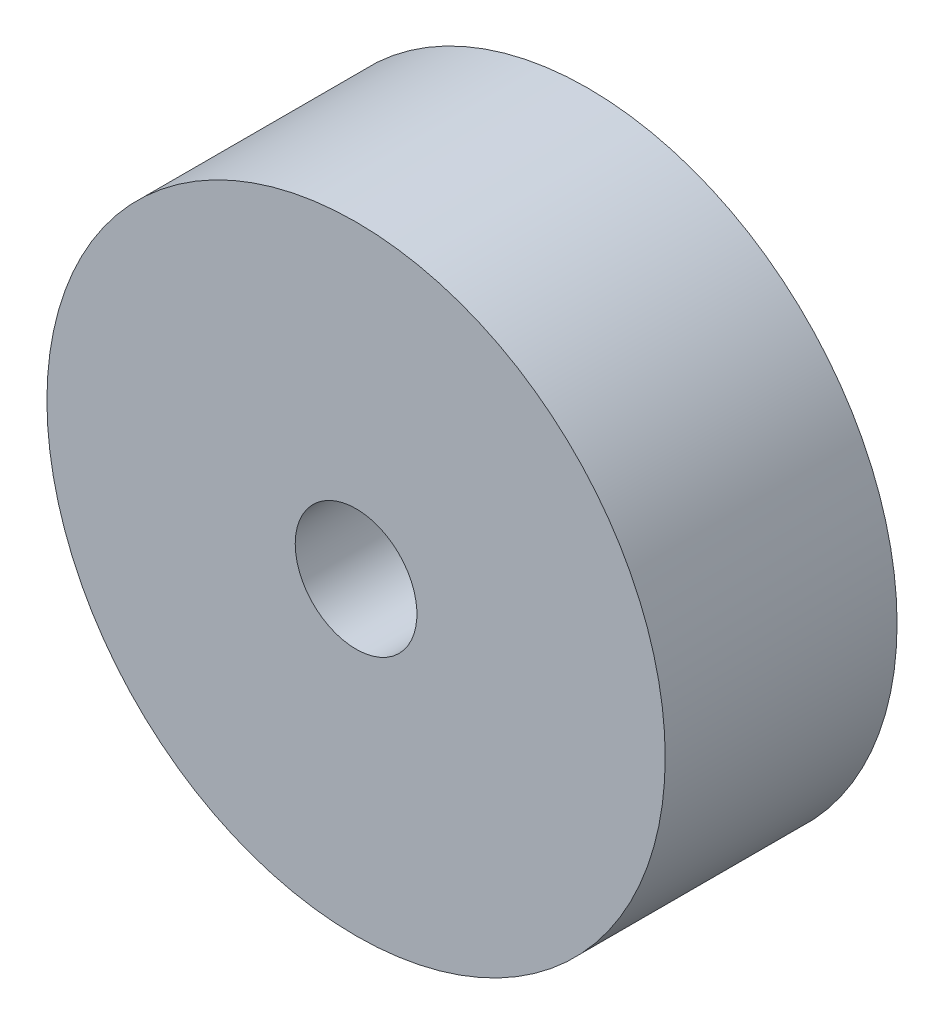
ISO-10303-21;
HEADER;
FILE_DESCRIPTION(('STEP AP214'),'2;1');
FILE_NAME('part.step','',(''),(''),'','','');
FILE_SCHEMA(('AUTOMOTIVE_DESIGN { 1 0 10303 214 1 1 1 1 }'));
ENDSEC;
DATA;
#1=APPLICATION_CONTEXT('core data for automotive mechanical design processes');
#2=APPLICATION_PROTOCOL_DEFINITION('international standard','automotive_design',2000,#1);
#3=PRODUCT_CONTEXT('',#1,'mechanical');
#4=PRODUCT('Part','Part','',(#3));
#5=PRODUCT_RELATED_PRODUCT_CATEGORY('part','',(#4));
#6=PRODUCT_DEFINITION_FORMATION('','',#4);
#7=PRODUCT_DEFINITION_CONTEXT('part definition',#1,'design');
#8=PRODUCT_DEFINITION('design','',#6,#7);
#9=PRODUCT_DEFINITION_SHAPE('','',#8);
#10=(LENGTH_UNIT() NAMED_UNIT(*) SI_UNIT(.MILLI.,.METRE.));
#11=(NAMED_UNIT(*) PLANE_ANGLE_UNIT() SI_UNIT($,.RADIAN.));
#12=(NAMED_UNIT(*) SI_UNIT($,.STERADIAN.) SOLID_ANGLE_UNIT());
#13=UNCERTAINTY_MEASURE_WITH_UNIT(LENGTH_MEASURE(1.E-05),#10,'distance_accuracy_value','');
#14=(GEOMETRIC_REPRESENTATION_CONTEXT(3) GLOBAL_UNCERTAINTY_ASSIGNED_CONTEXT((#13)) GLOBAL_UNIT_ASSIGNED_CONTEXT((#10,
#11,#12)) REPRESENTATION_CONTEXT('',''));
#15=CARTESIAN_POINT('',(0.,0.,0.));
#16=DIRECTION('',(0.,0.,1.));
#17=DIRECTION('',(1.,0.,0.));
#18=AXIS2_PLACEMENT_3D('',#15,#16,#17);
#19=CARTESIAN_POINT('',(0.,0.,9.525));
#20=DIRECTION('',(0.,0.,1.));
#21=DIRECTION('',(1.,0.,0.));
#22=AXIS2_PLACEMENT_3D('',#19,#20,#21);
#23=PLANE('',#22);
#24=CARTESIAN_POINT('',(0.,0.,9.525));
#25=DIRECTION('',(0.,0.,1.));
#26=DIRECTION('',(1.,0.,0.));
#27=AXIS2_PLACEMENT_3D('',#24,#25,#26);
#28=CIRCLE('',#27,25.4);
#29=CARTESIAN_POINT('',(-25.4,0.,9.525));
#30=VERTEX_POINT('',#29);
#31=EDGE_CURVE('E10',#30,#30,#28,.T.);
#32=ORIENTED_EDGE('',*,*,#31,.T.);
#33=EDGE_LOOP('',(#32));
#34=FACE_BOUND('',#33,.T.);
#35=CARTESIAN_POINT('',(0.,0.,9.525));
#36=DIRECTION('',(0.,0.,1.));
#37=DIRECTION('',(1.,0.,0.));
#38=AXIS2_PLACEMENT_3D('',#35,#36,#37);
#39=CIRCLE('',#38,5.);
#40=CARTESIAN_POINT('',(-5.,0.,9.525));
#41=VERTEX_POINT('',#40);
#42=EDGE_CURVE('E54',#41,#41,#39,.T.);
#43=ORIENTED_EDGE('',*,*,#42,.F.);
#44=EDGE_LOOP('',(#43));
#45=FACE_BOUND('',#44,.T.);
#46=ADVANCED_FACE('F41',(#34,#45),#23,.T.);
#47=CARTESIAN_POINT('',(0.,0.,-9.525));
#48=DIRECTION('',(0.,0.,1.));
#49=DIRECTION('',(1.,0.,0.));
#50=AXIS2_PLACEMENT_3D('',#47,#48,#49);
#51=PLANE('',#50);
#52=CARTESIAN_POINT('',(0.,0.,-9.525));
#53=DIRECTION('',(0.,0.,1.));
#54=DIRECTION('',(1.,0.,0.));
#55=AXIS2_PLACEMENT_3D('',#52,#53,#54);
#56=CIRCLE('',#55,25.4);
#57=CARTESIAN_POINT('',(-25.4,0.,-9.525));
#58=VERTEX_POINT('',#57);
#59=EDGE_CURVE('E45',#58,#58,#56,.T.);
#60=ORIENTED_EDGE('',*,*,#59,.F.);
#61=EDGE_LOOP('',(#60));
#62=FACE_BOUND('',#61,.T.);
#63=CARTESIAN_POINT('',(0.,0.,-9.525));
#64=DIRECTION('',(0.,0.,1.));
#65=DIRECTION('',(1.,0.,0.));
#66=AXIS2_PLACEMENT_3D('',#63,#64,#65);
#67=CIRCLE('',#66,5.);
#68=CARTESIAN_POINT('',(-5.,0.,-9.525));
#69=VERTEX_POINT('',#68);
#70=EDGE_CURVE('E56',#69,#69,#67,.T.);
#71=ORIENTED_EDGE('',*,*,#70,.T.);
#72=EDGE_LOOP('',(#71));
#73=FACE_BOUND('',#72,.T.);
#74=ADVANCED_FACE('F68',(#62,#73),#51,.F.);
#75=CARTESIAN_POINT('',(0.,0.,9.525));
#76=DIRECTION('',(0.,0.,-1.));
#77=DIRECTION('',(-1.,0.,0.));
#78=AXIS2_PLACEMENT_3D('',#75,#76,#77);
#79=CYLINDRICAL_SURFACE('',#78,25.4);
#80=CARTESIAN_POINT('',(-25.4,0.,9.525));
#81=CARTESIAN_POINT('',(-25.4,0.,9.3265625));
#82=CARTESIAN_POINT('',(-25.4,0.,9.128125));
#83=CARTESIAN_POINT('',(-25.4,0.,8.73125));
#84=CARTESIAN_POINT('',(-25.4,0.,8.5328125));
#85=CARTESIAN_POINT('',(-25.4,0.,8.1359375));
#86=CARTESIAN_POINT('',(-25.4,0.,7.9375));
#87=CARTESIAN_POINT('',(-25.4,0.,7.540625));
#88=CARTESIAN_POINT('',(-25.4,0.,7.3421875));
#89=CARTESIAN_POINT('',(-25.4,0.,6.9453125));
#90=CARTESIAN_POINT('',(-25.4,0.,6.746875));
#91=CARTESIAN_POINT('',(-25.4,0.,6.35));
#92=CARTESIAN_POINT('',(-25.4,0.,6.1515625));
#93=CARTESIAN_POINT('',(-25.4,0.,5.7546875));
#94=CARTESIAN_POINT('',(-25.4,0.,5.55625));
#95=CARTESIAN_POINT('',(-25.4,0.,5.159375));
#96=CARTESIAN_POINT('',(-25.4,0.,4.9609375));
#97=CARTESIAN_POINT('',(-25.4,0.,4.5640625));
#98=CARTESIAN_POINT('',(-25.4,0.,4.365625));
#99=CARTESIAN_POINT('',(-25.4,0.,3.96875));
#100=CARTESIAN_POINT('',(-25.4,0.,3.7703125));
#101=CARTESIAN_POINT('',(-25.4,0.,3.3734375));
#102=CARTESIAN_POINT('',(-25.4,0.,3.175));
#103=CARTESIAN_POINT('',(-25.4,0.,2.778125));
#104=CARTESIAN_POINT('',(-25.4,0.,2.5796875));
#105=CARTESIAN_POINT('',(-25.4,0.,2.1828125));
#106=CARTESIAN_POINT('',(-25.4,0.,1.984375));
#107=CARTESIAN_POINT('',(-25.4,0.,1.5875));
#108=CARTESIAN_POINT('',(-25.4,0.,1.3890625));
#109=CARTESIAN_POINT('',(-25.4,0.,0.992187499999999));
#110=CARTESIAN_POINT('',(-25.4,0.,0.793749999999999));
#111=CARTESIAN_POINT('',(-25.4,0.,0.396874999999998));
#112=CARTESIAN_POINT('',(-25.4,0.,0.198437499999998));
#113=CARTESIAN_POINT('',(-25.4,0.,-0.198437500000002));
#114=CARTESIAN_POINT('',(-25.4,0.,-0.396875000000002));
#115=CARTESIAN_POINT('',(-25.4,0.,-0.793750000000002));
#116=CARTESIAN_POINT('',(-25.4,0.,-0.992187500000002));
#117=CARTESIAN_POINT('',(-25.4,0.,-1.3890625));
#118=CARTESIAN_POINT('',(-25.4,0.,-1.5875));
#119=CARTESIAN_POINT('',(-25.4,0.,-1.984375));
#120=CARTESIAN_POINT('',(-25.4,0.,-2.1828125));
#121=CARTESIAN_POINT('',(-25.4,0.,-2.5796875));
#122=CARTESIAN_POINT('',(-25.4,0.,-2.778125));
#123=CARTESIAN_POINT('',(-25.4,0.,-3.175));
#124=CARTESIAN_POINT('',(-25.4,0.,-3.3734375));
#125=CARTESIAN_POINT('',(-25.4,0.,-3.7703125));
#126=CARTESIAN_POINT('',(-25.4,0.,-3.96875));
#127=CARTESIAN_POINT('',(-25.4,0.,-4.365625));
#128=CARTESIAN_POINT('',(-25.4,0.,-4.5640625));
#129=CARTESIAN_POINT('',(-25.4,0.,-4.9609375));
#130=CARTESIAN_POINT('',(-25.4,0.,-5.159375));
#131=CARTESIAN_POINT('',(-25.4,0.,-5.55625));
#132=CARTESIAN_POINT('',(-25.4,0.,-5.7546875));
#133=CARTESIAN_POINT('',(-25.4,0.,-6.1515625));
#134=CARTESIAN_POINT('',(-25.4,0.,-6.35));
#135=CARTESIAN_POINT('',(-25.4,0.,-6.746875));
#136=CARTESIAN_POINT('',(-25.4,0.,-6.9453125));
#137=CARTESIAN_POINT('',(-25.4,0.,-7.3421875));
#138=CARTESIAN_POINT('',(-25.4,0.,-7.540625));
#139=CARTESIAN_POINT('',(-25.4,0.,-7.9375));
#140=CARTESIAN_POINT('',(-25.4,0.,-8.1359375));
#141=CARTESIAN_POINT('',(-25.4,0.,-8.5328125));
#142=CARTESIAN_POINT('',(-25.4,0.,-8.73125));
#143=CARTESIAN_POINT('',(-25.4,0.,-9.128125));
#144=CARTESIAN_POINT('',(-25.4,0.,-9.3265625));
#145=CARTESIAN_POINT('',(-25.4,0.,-9.525));
#146=B_SPLINE_CURVE_WITH_KNOTS('',3,(#80,#81,#82,#83,#84,#85,#86,#87,#88,#89,#90,#91,#92,#93,
#94,#95,#96,#97,#98,#99,#100,#101,#102,#103,#104,#105,#106,#107,#108,#109,#110,#111,#112,#113,
#114,#115,#116,#117,#118,#119,#120,#121,#122,#123,#124,#125,#126,#127,#128,#129,#130,#131,#132,
#133,#134,#135,#136,#137,#138,#139,#140,#141,#142,#143,#144,#145),.UNSPECIFIED.,.F.,.F.,(4,2,2,
2,2,2,2,2,2,2,2,2,2,2,2,2,2,2,2,2,2,2,2,2,2,2,2,2,2,2,2,2,4),(0.,0.595312499999999,1.190625,
1.7859375,2.38125,2.9765625,3.571875,4.1671875,4.7625,5.3578125,5.953125,6.5484375,7.14375,
7.7390625,8.334375,8.9296875,9.525,10.1203125,10.715625,11.3109375,11.90625,12.5015625,
13.096875,13.6921875,14.2875,14.8828125,15.478125,16.0734375,16.66875,17.2640625,17.859375,
18.4546875,19.05),.UNSPECIFIED.);
#147=EDGE_CURVE('BSEAM43',#30,#58,#146,.T.);
#148=ORIENTED_EDGE('',*,*,#31,.F.);
#149=ORIENTED_EDGE('',*,*,#59,.T.);
#150=ORIENTED_EDGE('',*,*,#147,.T.);
#151=ORIENTED_EDGE('',*,*,#147,.F.);
#152=EDGE_LOOP('',(#148,#150,#149,#151));
#153=FACE_BOUND('',#152,.T.);
#154=ADVANCED_FACE('F43',(#153),#79,.T.);
#155=CARTESIAN_POINT('',(0.,0.,9.525));
#156=DIRECTION('',(0.,0.,-1.));
#157=DIRECTION('',(-1.,0.,0.));
#158=AXIS2_PLACEMENT_3D('',#155,#156,#157);
#159=CYLINDRICAL_SURFACE('',#158,5.);
#160=CARTESIAN_POINT('',(-5.,0.,9.525));
#161=CARTESIAN_POINT('',(-5.,0.,9.3265625));
#162=CARTESIAN_POINT('',(-5.,0.,9.128125));
#163=CARTESIAN_POINT('',(-5.,0.,8.73125));
#164=CARTESIAN_POINT('',(-5.,0.,8.5328125));
#165=CARTESIAN_POINT('',(-5.,0.,8.1359375));
#166=CARTESIAN_POINT('',(-5.,0.,7.9375));
#167=CARTESIAN_POINT('',(-5.,0.,7.540625));
#168=CARTESIAN_POINT('',(-5.,0.,7.3421875));
#169=CARTESIAN_POINT('',(-5.,0.,6.9453125));
#170=CARTESIAN_POINT('',(-5.,0.,6.746875));
#171=CARTESIAN_POINT('',(-5.,0.,6.35));
#172=CARTESIAN_POINT('',(-5.,0.,6.1515625));
#173=CARTESIAN_POINT('',(-5.,0.,5.7546875));
#174=CARTESIAN_POINT('',(-5.,0.,5.55625));
#175=CARTESIAN_POINT('',(-5.,0.,5.159375));
#176=CARTESIAN_POINT('',(-5.,0.,4.9609375));
#177=CARTESIAN_POINT('',(-5.,0.,4.5640625));
#178=CARTESIAN_POINT('',(-5.,0.,4.365625));
#179=CARTESIAN_POINT('',(-5.,0.,3.96875));
#180=CARTESIAN_POINT('',(-5.,0.,3.7703125));
#181=CARTESIAN_POINT('',(-5.,0.,3.3734375));
#182=CARTESIAN_POINT('',(-5.,0.,3.175));
#183=CARTESIAN_POINT('',(-5.,0.,2.778125));
#184=CARTESIAN_POINT('',(-5.,0.,2.5796875));
#185=CARTESIAN_POINT('',(-5.,0.,2.1828125));
#186=CARTESIAN_POINT('',(-5.,0.,1.984375));
#187=CARTESIAN_POINT('',(-5.,0.,1.5875));
#188=CARTESIAN_POINT('',(-5.,0.,1.3890625));
#189=CARTESIAN_POINT('',(-5.,0.,0.992187500000001));
#190=CARTESIAN_POINT('',(-5.,0.,0.793750000000001));
#191=CARTESIAN_POINT('',(-5.,0.,0.396875));
#192=CARTESIAN_POINT('',(-5.,0.,0.1984375));
#193=CARTESIAN_POINT('',(-5.,0.,-0.1984375));
#194=CARTESIAN_POINT('',(-5.,0.,-0.396875));
#195=CARTESIAN_POINT('',(-5.,0.,-0.793750000000001));
#196=CARTESIAN_POINT('',(-5.,0.,-0.992187500000001));
#197=CARTESIAN_POINT('',(-5.,0.,-1.3890625));
#198=CARTESIAN_POINT('',(-5.,0.,-1.5875));
#199=CARTESIAN_POINT('',(-5.,0.,-1.984375));
#200=CARTESIAN_POINT('',(-5.,0.,-2.1828125));
#201=CARTESIAN_POINT('',(-5.,0.,-2.5796875));
#202=CARTESIAN_POINT('',(-5.,0.,-2.778125));
#203=CARTESIAN_POINT('',(-5.,0.,-3.175));
#204=CARTESIAN_POINT('',(-5.,0.,-3.3734375));
#205=CARTESIAN_POINT('',(-5.,0.,-3.7703125));
#206=CARTESIAN_POINT('',(-5.,0.,-3.96875));
#207=CARTESIAN_POINT('',(-5.,0.,-4.365625));
#208=CARTESIAN_POINT('',(-5.,0.,-4.5640625));
#209=CARTESIAN_POINT('',(-5.,0.,-4.9609375));
#210=CARTESIAN_POINT('',(-5.,0.,-5.159375));
#211=CARTESIAN_POINT('',(-5.,0.,-5.55625));
#212=CARTESIAN_POINT('',(-5.,0.,-5.7546875));
#213=CARTESIAN_POINT('',(-5.,0.,-6.1515625));
#214=CARTESIAN_POINT('',(-5.,0.,-6.35));
#215=CARTESIAN_POINT('',(-5.,0.,-6.746875));
#216=CARTESIAN_POINT('',(-5.,0.,-6.9453125));
#217=CARTESIAN_POINT('',(-5.,0.,-7.3421875));
#218=CARTESIAN_POINT('',(-5.,0.,-7.540625));
#219=CARTESIAN_POINT('',(-5.,0.,-7.9375));
#220=CARTESIAN_POINT('',(-5.,0.,-8.1359375));
#221=CARTESIAN_POINT('',(-5.,0.,-8.5328125));
#222=CARTESIAN_POINT('',(-5.,0.,-8.73125));
#223=CARTESIAN_POINT('',(-5.,0.,-9.128125));
#224=CARTESIAN_POINT('',(-5.,0.,-9.3265625));
#225=CARTESIAN_POINT('',(-5.,0.,-9.525));
#226=B_SPLINE_CURVE_WITH_KNOTS('',3,(#160,#161,#162,#163,#164,#165,#166,#167,#168,#169,#170,
#171,#172,#173,#174,#175,#176,#177,#178,#179,#180,#181,#182,#183,#184,#185,#186,#187,#188,#189,
#190,#191,#192,#193,#194,#195,#196,#197,#198,#199,#200,#201,#202,#203,#204,#205,#206,#207,#208,
#209,#210,#211,#212,#213,#214,#215,#216,#217,#218,#219,#220,#221,#222,#223,#224,#225),
.UNSPECIFIED.,.F.,.F.,(4,2,2,2,2,2,2,2,2,2,2,2,2,2,2,2,2,2,2,2,2,2,2,2,2,2,2,2,2,2,2,2,4),(0.,
0.5953125,1.190625,1.7859375,2.38125,2.9765625,3.571875,4.1671875,4.7625,5.3578125,5.953125,
6.5484375,7.14375,7.7390625,8.334375,8.9296875,9.525,10.1203125,10.715625,11.3109375,11.90625,
12.5015625,13.096875,13.6921875,14.2875,14.8828125,15.478125,16.0734375,16.66875,17.2640625,
17.859375,18.4546875,19.05),.UNSPECIFIED.);
#227=EDGE_CURVE('BSEAM64',#41,#69,#226,.T.);
#228=ORIENTED_EDGE('',*,*,#42,.T.);
#229=ORIENTED_EDGE('',*,*,#70,.F.);
#230=ORIENTED_EDGE('',*,*,#227,.T.);
#231=ORIENTED_EDGE('',*,*,#227,.F.);
#232=EDGE_LOOP('',(#228,#230,#229,#231));
#233=FACE_BOUND('',#232,.T.);
#234=ADVANCED_FACE('F64',(#233),#159,.F.);
#235=CLOSED_SHELL('',(#46,#74,#154,#234));
#236=MANIFOLD_SOLID_BREP('B2',#235);
#237=ADVANCED_BREP_SHAPE_REPRESENTATION('',(#18,#236),#14);
#238=SHAPE_DEFINITION_REPRESENTATION(#9,#237);
ENDSEC;
END-ISO-10303-21;
